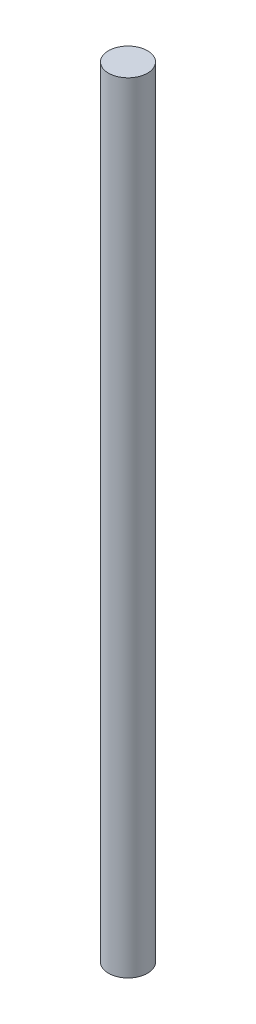
ISO-10303-21;
HEADER;
FILE_DESCRIPTION(('STEP AP214'),'2;1');
FILE_NAME('part.step','',(''),(''),'','','');
FILE_SCHEMA(('AUTOMOTIVE_DESIGN { 1 0 10303 214 1 1 1 1 }'));
ENDSEC;
DATA;
#1=APPLICATION_CONTEXT('core data for automotive mechanical design processes');
#2=APPLICATION_PROTOCOL_DEFINITION('international standard','automotive_design',2000,#1);
#3=PRODUCT_CONTEXT('',#1,'mechanical');
#4=PRODUCT('Part','Part','',(#3));
#5=PRODUCT_RELATED_PRODUCT_CATEGORY('part','',(#4));
#6=PRODUCT_DEFINITION_FORMATION('','',#4);
#7=PRODUCT_DEFINITION_CONTEXT('part definition',#1,'design');
#8=PRODUCT_DEFINITION('design','',#6,#7);
#9=PRODUCT_DEFINITION_SHAPE('','',#8);
#10=(LENGTH_UNIT() NAMED_UNIT(*) SI_UNIT(.MILLI.,.METRE.));
#11=(NAMED_UNIT(*) PLANE_ANGLE_UNIT() SI_UNIT($,.RADIAN.));
#12=(NAMED_UNIT(*) SI_UNIT($,.STERADIAN.) SOLID_ANGLE_UNIT());
#13=UNCERTAINTY_MEASURE_WITH_UNIT(LENGTH_MEASURE(1.E-05),#10,'distance_accuracy_value','');
#14=(GEOMETRIC_REPRESENTATION_CONTEXT(3) GLOBAL_UNCERTAINTY_ASSIGNED_CONTEXT((#13)) GLOBAL_UNIT_ASSIGNED_CONTEXT((#10,
#11,#12)) REPRESENTATION_CONTEXT('',''));
#15=CARTESIAN_POINT('',(0.,0.,0.));
#16=DIRECTION('',(0.,0.,1.));
#17=DIRECTION('',(1.,0.,0.));
#18=AXIS2_PLACEMENT_3D('',#15,#16,#17);
#19=CARTESIAN_POINT('',(0.,120.,0.));
#20=DIRECTION('',(0.,-1.,0.));
#21=DIRECTION('',(0.,0.,-1.));
#22=AXIS2_PLACEMENT_3D('',#19,#20,#21);
#23=CYLINDRICAL_SURFACE('',#22,3.);
#24=CARTESIAN_POINT('',(0.,120.,0.));
#25=DIRECTION('',(0.,1.,0.));
#26=DIRECTION('',(0.,0.,1.));
#27=AXIS2_PLACEMENT_3D('',#24,#25,#26);
#28=CIRCLE('',#27,3.);
#29=CARTESIAN_POINT('',(0.,120.,3.));
#30=VERTEX_POINT('',#29);
#31=EDGE_CURVE('E10',#30,#30,#28,.T.);
#32=ORIENTED_EDGE('',*,*,#31,.F.);
#33=EDGE_LOOP('',(#32));
#34=FACE_BOUND('',#33,.T.);
#35=CARTESIAN_POINT('',(0.,0.,0.));
#36=DIRECTION('',(0.,1.,0.));
#37=DIRECTION('',(0.,0.,1.));
#38=AXIS2_PLACEMENT_3D('',#35,#36,#37);
#39=CIRCLE('',#38,3.);
#40=CARTESIAN_POINT('',(0.,0.,3.));
#41=VERTEX_POINT('',#40);
#42=EDGE_CURVE('E33',#41,#41,#39,.T.);
#43=ORIENTED_EDGE('',*,*,#42,.T.);
#44=EDGE_LOOP('',(#43));
#45=FACE_BOUND('',#44,.T.);
#46=ADVANCED_FACE('F30',(#34,#45),#23,.T.);
#47=CARTESIAN_POINT('',(0.,120.,0.));
#48=DIRECTION('',(0.,1.,0.));
#49=DIRECTION('',(0.,0.,1.));
#50=AXIS2_PLACEMENT_3D('',#47,#48,#49);
#51=PLANE('',#50);
#52=ORIENTED_EDGE('',*,*,#31,.T.);
#53=EDGE_LOOP('',(#52));
#54=FACE_BOUND('',#53,.T.);
#55=ADVANCED_FACE('F45',(#54),#51,.T.);
#56=CARTESIAN_POINT('',(0.,0.,0.));
#57=DIRECTION('',(0.,1.,0.));
#58=DIRECTION('',(0.,0.,1.));
#59=AXIS2_PLACEMENT_3D('',#56,#57,#58);
#60=PLANE('',#59);
#61=ORIENTED_EDGE('',*,*,#42,.F.);
#62=EDGE_LOOP('',(#61));
#63=FACE_BOUND('',#62,.T.);
#64=ADVANCED_FACE('F43',(#63),#60,.F.);
#65=CLOSED_SHELL('',(#46,#55,#64));
#66=MANIFOLD_SOLID_BREP('B2',#65);
#67=ADVANCED_BREP_SHAPE_REPRESENTATION('',(#18,#66),#14);
#68=SHAPE_DEFINITION_REPRESENTATION(#9,#67);
ENDSEC;
END-ISO-10303-21;
